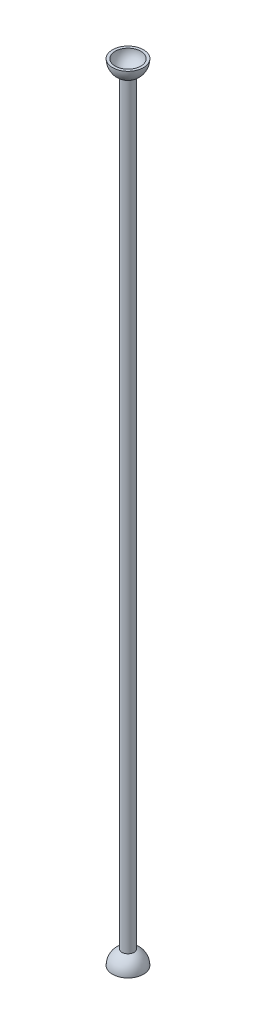
ISO-10303-21;
HEADER;
FILE_DESCRIPTION(('STEP AP214'),'2;1');
FILE_NAME('part.step','',(''),(''),'','','');
FILE_SCHEMA(('AUTOMOTIVE_DESIGN { 1 0 10303 214 1 1 1 1 }'));
ENDSEC;
DATA;
#1=APPLICATION_CONTEXT('core data for automotive mechanical design processes');
#2=APPLICATION_PROTOCOL_DEFINITION('international standard','automotive_design',2000,#1);
#3=PRODUCT_CONTEXT('',#1,'mechanical');
#4=PRODUCT('Part','Part','',(#3));
#5=PRODUCT_RELATED_PRODUCT_CATEGORY('part','',(#4));
#6=PRODUCT_DEFINITION_FORMATION('','',#4);
#7=PRODUCT_DEFINITION_CONTEXT('part definition',#1,'design');
#8=PRODUCT_DEFINITION('design','',#6,#7);
#9=PRODUCT_DEFINITION_SHAPE('','',#8);
#10=(LENGTH_UNIT() NAMED_UNIT(*) SI_UNIT(.MILLI.,.METRE.));
#11=(NAMED_UNIT(*) PLANE_ANGLE_UNIT() SI_UNIT($,.RADIAN.));
#12=(NAMED_UNIT(*) SI_UNIT($,.STERADIAN.) SOLID_ANGLE_UNIT());
#13=UNCERTAINTY_MEASURE_WITH_UNIT(LENGTH_MEASURE(1.E-05),#10,'distance_accuracy_value','');
#14=(GEOMETRIC_REPRESENTATION_CONTEXT(3) GLOBAL_UNCERTAINTY_ASSIGNED_CONTEXT((#13)) GLOBAL_UNIT_ASSIGNED_CONTEXT((#10,
#11,#12)) REPRESENTATION_CONTEXT('',''));
#15=CARTESIAN_POINT('',(0.,0.,0.));
#16=DIRECTION('',(0.,0.,1.));
#17=DIRECTION('',(1.,0.,0.));
#18=AXIS2_PLACEMENT_3D('',#15,#16,#17);
#19=CARTESIAN_POINT('',(0.,250.,0.));
#20=DIRECTION('',(0.,-1.,0.));
#21=DIRECTION('',(0.,0.,-1.));
#22=AXIS2_PLACEMENT_3D('',#19,#20,#21);
#23=CYLINDRICAL_SURFACE('',#22,2.);
#24=CARTESIAN_POINT('',(0.,250.,0.));
#25=DIRECTION('',(0.,1.,0.));
#26=DIRECTION('',(0.,0.,1.));
#27=AXIS2_PLACEMENT_3D('',#24,#25,#26);
#28=CIRCLE('',#27,2.);
#29=CARTESIAN_POINT('',(0.,250.,2.));
#30=VERTEX_POINT('',#29);
#31=EDGE_CURVE('E10',#30,#30,#28,.T.);
#32=ORIENTED_EDGE('',*,*,#31,.F.);
#33=EDGE_LOOP('',(#32));
#34=FACE_BOUND('',#33,.T.);
#35=CARTESIAN_POINT('',(0.,0.,0.));
#36=DIRECTION('',(0.,1.,0.));
#37=DIRECTION('',(0.,0.,1.));
#38=AXIS2_PLACEMENT_3D('',#35,#36,#37);
#39=CIRCLE('',#38,2.00000000000002);
#40=CARTESIAN_POINT('',(0.,0.,2.00000000000002));
#41=VERTEX_POINT('',#40);
#42=EDGE_CURVE('E45',#41,#41,#39,.F.);
#43=ORIENTED_EDGE('',*,*,#42,.F.);
#44=EDGE_LOOP('',(#43));
#45=FACE_BOUND('',#44,.T.);
#46=ADVANCED_FACE('F31',(#34,#45),#23,.T.);
#47=CARTESIAN_POINT('',(0.,254.714113700126,0.));
#48=DIRECTION('',(0.,1.,0.));
#49=DIRECTION('',(1.,0.,0.));
#50=AXIS2_PLACEMENT_3D('',#47,#48,#49);
#51=SPHERICAL_SURFACE('',#50,4.24999999999999);
#52=CARTESIAN_POINT('',(0.,254.714113700126,0.));
#53=DIRECTION('',(0.,1.,0.));
#54=DIRECTION('',(0.,0.,1.));
#55=AXIS2_PLACEMENT_3D('',#52,#53,#54);
#56=CIRCLE('',#55,4.25);
#57=CARTESIAN_POINT('',(0.,254.714113700126,4.25));
#58=VERTEX_POINT('',#57);
#59=EDGE_CURVE('E41',#58,#58,#56,.T.);
#60=ORIENTED_EDGE('',*,*,#59,.T.);
#61=EDGE_LOOP('',(#60));
#62=FACE_BOUND('',#61,.T.);
#63=ADVANCED_FACE('F74',(#62),#51,.F.);
#64=CARTESIAN_POINT('',(0.,254.714113700126,0.));
#65=DIRECTION('',(0.,1.,0.));
#66=DIRECTION('',(-1.,0.,0.));
#67=AXIS2_PLACEMENT_3D('',#64,#65,#66);
#68=SPHERICAL_SURFACE('',#67,5.12082688417744);
#69=ORIENTED_EDGE('',*,*,#31,.T.);
#70=EDGE_LOOP('',(#69));
#71=FACE_BOUND('',#70,.T.);
#72=CARTESIAN_POINT('',(0.,254.714113700126,0.));
#73=DIRECTION('',(0.,1.,0.));
#74=DIRECTION('',(0.,0.,1.));
#75=AXIS2_PLACEMENT_3D('',#72,#73,#74);
#76=CIRCLE('',#75,5.12082688417744);
#77=CARTESIAN_POINT('',(0.,254.714113700126,5.12082688417744));
#78=VERTEX_POINT('',#77);
#79=EDGE_CURVE('E37',#78,#78,#76,.T.);
#80=ORIENTED_EDGE('',*,*,#79,.F.);
#81=EDGE_LOOP('',(#80));
#82=FACE_BOUND('',#81,.T.);
#83=ADVANCED_FACE('F79',(#71,#82),#68,.T.);
#84=CARTESIAN_POINT('',(4.25,254.714113700126,0.));
#85=DIRECTION('',(0.,-1.,0.));
#86=DIRECTION('',(0.,0.,-1.));
#87=AXIS2_PLACEMENT_3D('',#84,#85,#86);
#88=PLANE('',#87);
#89=ORIENTED_EDGE('',*,*,#59,.F.);
#90=EDGE_LOOP('',(#89));
#91=FACE_BOUND('',#90,.T.);
#92=ORIENTED_EDGE('',*,*,#79,.T.);
#93=EDGE_LOOP('',(#92));
#94=FACE_BOUND('',#93,.T.);
#95=ADVANCED_FACE('F69',(#91,#94),#88,.F.);
#96=CARTESIAN_POINT('',(0.,-4.71411370012587,0.));
#97=DIRECTION('',(0.,-1.,0.));
#98=DIRECTION('',(-1.,0.,0.));
#99=AXIS2_PLACEMENT_3D('',#96,#97,#98);
#100=SPHERICAL_SURFACE('',#99,5.12082688417744);
#101=CARTESIAN_POINT('',(0.,-4.71411370012587,0.));
#102=DIRECTION('',(0.,1.,0.));
#103=DIRECTION('',(0.,0.,1.));
#104=AXIS2_PLACEMENT_3D('',#101,#102,#103);
#105=CIRCLE('',#104,5.12082688417744);
#106=CARTESIAN_POINT('',(0.,-4.71411370012587,5.12082688417744));
#107=VERTEX_POINT('',#106);
#108=EDGE_CURVE('E50',#107,#107,#105,.T.);
#109=ORIENTED_EDGE('',*,*,#108,.T.);
#110=EDGE_LOOP('',(#109));
#111=FACE_BOUND('',#110,.T.);
#112=ORIENTED_EDGE('',*,*,#42,.T.);
#113=EDGE_LOOP('',(#112));
#114=FACE_BOUND('',#113,.T.);
#115=ADVANCED_FACE('F62',(#111,#114),#100,.T.);
#116=CARTESIAN_POINT('',(0.,-4.71411370012587,0.));
#117=DIRECTION('',(0.,-1.,0.));
#118=DIRECTION('',(1.,0.,0.));
#119=AXIS2_PLACEMENT_3D('',#116,#117,#118);
#120=SPHERICAL_SURFACE('',#119,4.24999999999999);
#121=CARTESIAN_POINT('',(0.,-4.71411370012587,0.));
#122=DIRECTION('',(0.,1.,0.));
#123=DIRECTION('',(0.,0.,1.));
#124=AXIS2_PLACEMENT_3D('',#121,#122,#123);
#125=CIRCLE('',#124,4.25);
#126=CARTESIAN_POINT('',(0.,-4.71411370012587,4.25));
#127=VERTEX_POINT('',#126);
#128=EDGE_CURVE('E53',#127,#127,#125,.T.);
#129=ORIENTED_EDGE('',*,*,#128,.F.);
#130=EDGE_LOOP('',(#129));
#131=FACE_BOUND('',#130,.T.);
#132=ADVANCED_FACE('F60',(#131),#120,.F.);
#133=CARTESIAN_POINT('',(4.25,-4.71411370012587,0.));
#134=DIRECTION('',(0.,1.,0.));
#135=DIRECTION('',(0.,0.,-1.));
#136=AXIS2_PLACEMENT_3D('',#133,#134,#135);
#137=PLANE('',#136);
#138=ORIENTED_EDGE('',*,*,#128,.T.);
#139=EDGE_LOOP('',(#138));
#140=FACE_BOUND('',#139,.T.);
#141=ORIENTED_EDGE('',*,*,#108,.F.);
#142=EDGE_LOOP('',(#141));
#143=FACE_BOUND('',#142,.T.);
#144=ADVANCED_FACE('F57',(#140,#143),#137,.F.);
#145=CLOSED_SHELL('',(#46,#63,#83,#95,#115,#132,#144));
#146=MANIFOLD_SOLID_BREP('B2',#145);
#147=ADVANCED_BREP_SHAPE_REPRESENTATION('',(#18,#146),#14);
#148=SHAPE_DEFINITION_REPRESENTATION(#9,#147);
ENDSEC;
END-ISO-10303-21;
